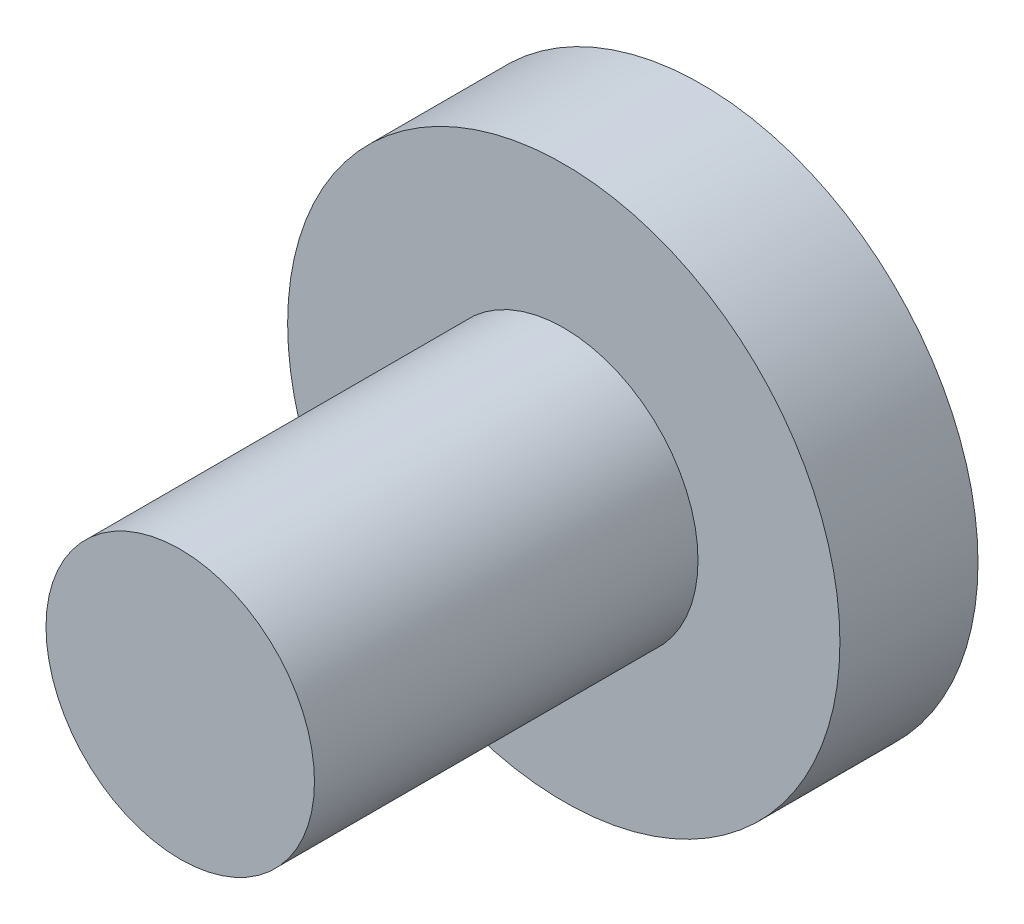
ISO-10303-21;
HEADER;
FILE_DESCRIPTION(('STEP AP214'),'2;1');
FILE_NAME('part.step','',(''),(''),'','','');
FILE_SCHEMA(('AUTOMOTIVE_DESIGN { 1 0 10303 214 1 1 1 1 }'));
ENDSEC;
DATA;
#1=APPLICATION_CONTEXT('core data for automotive mechanical design processes');
#2=APPLICATION_PROTOCOL_DEFINITION('international standard','automotive_design',2000,#1);
#3=PRODUCT_CONTEXT('',#1,'mechanical');
#4=PRODUCT('Part','Part','',(#3));
#5=PRODUCT_RELATED_PRODUCT_CATEGORY('part','',(#4));
#6=PRODUCT_DEFINITION_FORMATION('','',#4);
#7=PRODUCT_DEFINITION_CONTEXT('part definition',#1,'design');
#8=PRODUCT_DEFINITION('design','',#6,#7);
#9=PRODUCT_DEFINITION_SHAPE('','',#8);
#10=(LENGTH_UNIT() NAMED_UNIT(*) SI_UNIT(.MILLI.,.METRE.));
#11=(NAMED_UNIT(*) PLANE_ANGLE_UNIT() SI_UNIT($,.RADIAN.));
#12=(NAMED_UNIT(*) SI_UNIT($,.STERADIAN.) SOLID_ANGLE_UNIT());
#13=UNCERTAINTY_MEASURE_WITH_UNIT(LENGTH_MEASURE(1.E-05),#10,'distance_accuracy_value','');
#14=(GEOMETRIC_REPRESENTATION_CONTEXT(3) GLOBAL_UNCERTAINTY_ASSIGNED_CONTEXT((#13)) GLOBAL_UNIT_ASSIGNED_CONTEXT((#10,
#11,#12)) REPRESENTATION_CONTEXT('',''));
#15=CARTESIAN_POINT('',(0.,0.,0.));
#16=DIRECTION('',(0.,0.,1.));
#17=DIRECTION('',(1.,0.,0.));
#18=AXIS2_PLACEMENT_3D('',#15,#16,#17);
#19=CARTESIAN_POINT('',(0.,0.,1.8));
#20=DIRECTION('',(0.,0.,-1.));
#21=DIRECTION('',(-1.,0.,0.));
#22=AXIS2_PLACEMENT_3D('',#19,#20,#21);
#23=CYLINDRICAL_SURFACE('',#22,3.6);
#24=CARTESIAN_POINT('',(0.,0.,1.8));
#25=DIRECTION('',(0.,0.,1.));
#26=DIRECTION('',(1.,0.,0.));
#27=AXIS2_PLACEMENT_3D('',#24,#25,#26);
#28=CIRCLE('',#27,3.6);
#29=CARTESIAN_POINT('',(3.6,0.,1.8));
#30=VERTEX_POINT('',#29);
#31=EDGE_CURVE('E40',#30,#30,#28,.T.);
#32=ORIENTED_EDGE('',*,*,#31,.F.);
#33=EDGE_LOOP('',(#32));
#34=FACE_BOUND('',#33,.T.);
#35=CARTESIAN_POINT('',(0.,0.,0.));
#36=DIRECTION('',(0.,0.,1.));
#37=DIRECTION('',(1.,0.,0.));
#38=AXIS2_PLACEMENT_3D('',#35,#36,#37);
#39=CIRCLE('',#38,3.6);
#40=CARTESIAN_POINT('',(3.6,0.,0.));
#41=VERTEX_POINT('',#40);
#42=EDGE_CURVE('E36',#41,#41,#39,.T.);
#43=ORIENTED_EDGE('',*,*,#42,.T.);
#44=EDGE_LOOP('',(#43));
#45=FACE_BOUND('',#44,.T.);
#46=ADVANCED_FACE('F33',(#34,#45),#23,.T.);
#47=CARTESIAN_POINT('',(0.,0.,1.8));
#48=DIRECTION('',(0.,0.,1.));
#49=DIRECTION('',(1.,0.,0.));
#50=AXIS2_PLACEMENT_3D('',#47,#48,#49);
#51=PLANE('',#50);
#52=CARTESIAN_POINT('',(0.,0.,1.8));
#53=DIRECTION('',(0.,0.,1.));
#54=DIRECTION('',(1.,0.,0.));
#55=AXIS2_PLACEMENT_3D('',#52,#53,#54);
#56=CIRCLE('',#55,1.75);
#57=CARTESIAN_POINT('',(1.75,0.,1.8));
#58=VERTEX_POINT('',#57);
#59=EDGE_CURVE('E10',#58,#58,#56,.T.);
#60=ORIENTED_EDGE('',*,*,#59,.F.);
#61=EDGE_LOOP('',(#60));
#62=FACE_BOUND('',#61,.T.);
#63=ORIENTED_EDGE('',*,*,#31,.T.);
#64=EDGE_LOOP('',(#63));
#65=FACE_BOUND('',#64,.T.);
#66=ADVANCED_FACE('F57',(#62,#65),#51,.T.);
#67=CARTESIAN_POINT('',(0.,0.,0.));
#68=DIRECTION('',(0.,0.,1.));
#69=DIRECTION('',(1.,0.,0.));
#70=AXIS2_PLACEMENT_3D('',#67,#68,#69);
#71=PLANE('',#70);
#72=ORIENTED_EDGE('',*,*,#42,.F.);
#73=EDGE_LOOP('',(#72));
#74=FACE_BOUND('',#73,.T.);
#75=ADVANCED_FACE('F54',(#74),#71,.F.);
#76=CARTESIAN_POINT('',(0.,0.,6.8));
#77=DIRECTION('',(0.,0.,-1.));
#78=DIRECTION('',(-1.,0.,0.));
#79=AXIS2_PLACEMENT_3D('',#76,#77,#78);
#80=CYLINDRICAL_SURFACE('',#79,1.75);
#81=CARTESIAN_POINT('',(0.,0.,6.8));
#82=DIRECTION('',(0.,0.,1.));
#83=DIRECTION('',(1.,0.,0.));
#84=AXIS2_PLACEMENT_3D('',#81,#82,#83);
#85=CIRCLE('',#84,1.75);
#86=CARTESIAN_POINT('',(1.75,0.,6.8));
#87=VERTEX_POINT('',#86);
#88=EDGE_CURVE('E46',#87,#87,#85,.T.);
#89=ORIENTED_EDGE('',*,*,#88,.F.);
#90=EDGE_LOOP('',(#89));
#91=FACE_BOUND('',#90,.T.);
#92=ORIENTED_EDGE('',*,*,#59,.T.);
#93=EDGE_LOOP('',(#92));
#94=FACE_BOUND('',#93,.T.);
#95=ADVANCED_FACE('F56',(#91,#94),#80,.T.);
#96=CARTESIAN_POINT('',(0.,0.,6.8));
#97=DIRECTION('',(0.,0.,1.));
#98=DIRECTION('',(1.,0.,0.));
#99=AXIS2_PLACEMENT_3D('',#96,#97,#98);
#100=PLANE('',#99);
#101=ORIENTED_EDGE('',*,*,#88,.T.);
#102=EDGE_LOOP('',(#101));
#103=FACE_BOUND('',#102,.T.);
#104=ADVANCED_FACE('F62',(#103),#100,.T.);
#105=CLOSED_SHELL('',(#46,#66,#75,#95,#104));
#106=MANIFOLD_SOLID_BREP('B2',#105);
#107=ADVANCED_BREP_SHAPE_REPRESENTATION('',(#18,#106),#14);
#108=SHAPE_DEFINITION_REPRESENTATION(#9,#107);
ENDSEC;
END-ISO-10303-21;
